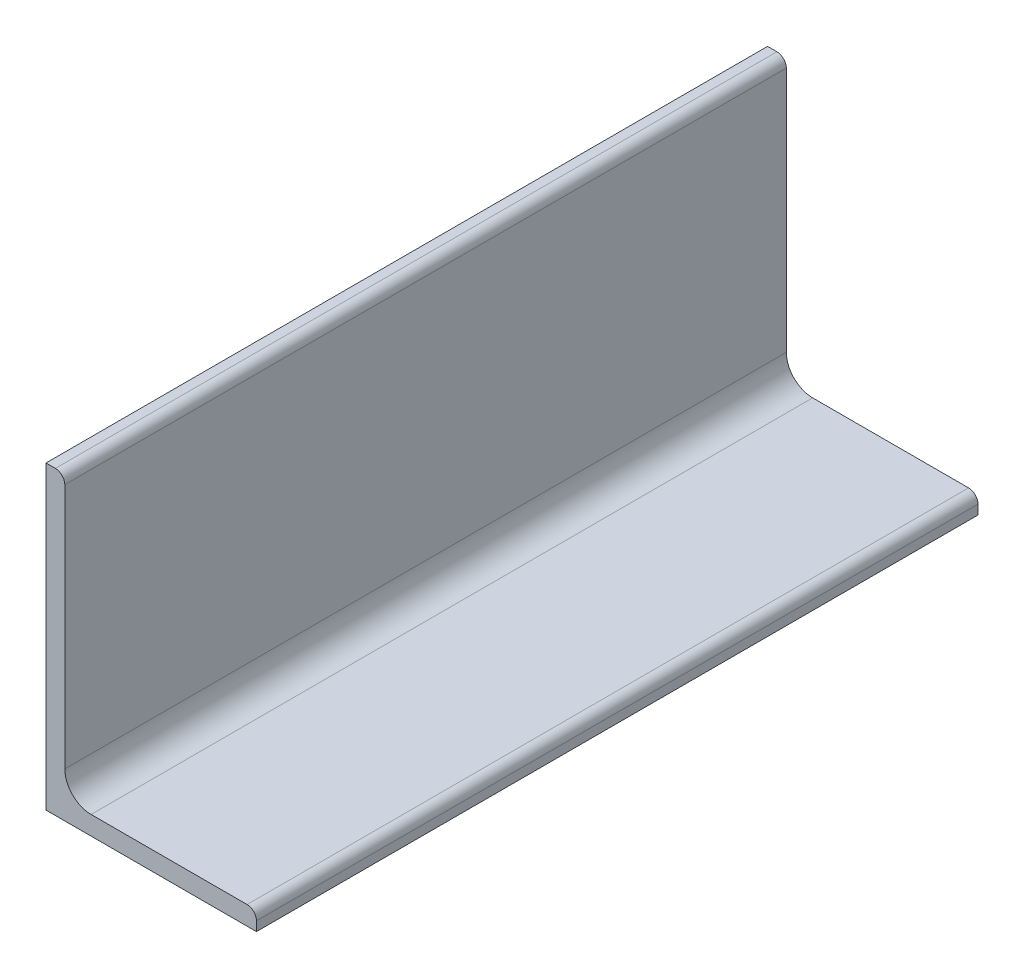
ISO-10303-21;
HEADER;
FILE_DESCRIPTION(('STEP AP214'),'2;1');
FILE_NAME('part.step','',(''),(''),'','','');
FILE_SCHEMA(('AUTOMOTIVE_DESIGN { 1 0 10303 214 1 1 1 1 }'));
ENDSEC;
DATA;
#1=APPLICATION_CONTEXT('core data for automotive mechanical design processes');
#2=APPLICATION_PROTOCOL_DEFINITION('international standard','automotive_design',2000,#1);
#3=PRODUCT_CONTEXT('',#1,'mechanical');
#4=PRODUCT('Part','Part','',(#3));
#5=PRODUCT_RELATED_PRODUCT_CATEGORY('part','',(#4));
#6=PRODUCT_DEFINITION_FORMATION('','',#4);
#7=PRODUCT_DEFINITION_CONTEXT('part definition',#1,'design');
#8=PRODUCT_DEFINITION('design','',#6,#7);
#9=PRODUCT_DEFINITION_SHAPE('','',#8);
#10=(LENGTH_UNIT() NAMED_UNIT(*) SI_UNIT(.MILLI.,.METRE.));
#11=(NAMED_UNIT(*) PLANE_ANGLE_UNIT() SI_UNIT($,.RADIAN.));
#12=(NAMED_UNIT(*) SI_UNIT($,.STERADIAN.) SOLID_ANGLE_UNIT());
#13=UNCERTAINTY_MEASURE_WITH_UNIT(LENGTH_MEASURE(1.E-05),#10,'distance_accuracy_value','');
#14=(GEOMETRIC_REPRESENTATION_CONTEXT(3) GLOBAL_UNCERTAINTY_ASSIGNED_CONTEXT((#13)) GLOBAL_UNIT_ASSIGNED_CONTEXT((#10,
#11,#12)) REPRESENTATION_CONTEXT('',''));
#15=CARTESIAN_POINT('',(0.,0.,0.));
#16=DIRECTION('',(0.,0.,1.));
#17=DIRECTION('',(1.,0.,0.));
#18=AXIS2_PLACEMENT_3D('',#15,#16,#17);
#19=CARTESIAN_POINT('',(0.0836264027816469,127.041655270204,304.8));
#20=DIRECTION('',(1.,0.,0.));
#21=DIRECTION('',(0.,0.,-1.));
#22=AXIS2_PLACEMENT_3D('',#19,#20,#21);
#23=PLANE('',#22);
#24=DIRECTION('',(0.,-1.,0.));
#25=VECTOR('',#24,1.);
#26=CARTESIAN_POINT('',(0.0836264027816469,127.041655270204,0.));
#27=LINE('',#26,#25);
#28=CARTESIAN_POINT('',(0.0836264027816469,127.041655270204,0.));
#29=VERTEX_POINT('',#28);
#30=CARTESIAN_POINT('',(0.0836264027816469,0.0416552702040917,0.));
#31=VERTEX_POINT('',#30);
#32=EDGE_CURVE('E135',#29,#31,#27,.T.);
#33=ORIENTED_EDGE('',*,*,#32,.T.);
#34=DIRECTION('',(0.,0.,-1.));
#35=VECTOR('',#34,1.);
#36=CARTESIAN_POINT('',(0.0836264027816469,0.0416552702040917,304.8));
#37=LINE('',#36,#35);
#38=CARTESIAN_POINT('',(0.0836264027816469,0.0416552702040917,304.8));
#39=VERTEX_POINT('',#38);
#40=EDGE_CURVE('E11',#39,#31,#37,.T.);
#41=ORIENTED_EDGE('',*,*,#40,.F.);
#42=DIRECTION('',(0.,-1.,0.));
#43=VECTOR('',#42,1.);
#44=CARTESIAN_POINT('',(0.0836264027816469,127.041655270204,304.8));
#45=LINE('',#44,#43);
#46=CARTESIAN_POINT('',(0.0836264027816469,127.041655270204,304.8));
#47=VERTEX_POINT('',#46);
#48=EDGE_CURVE('E151',#47,#39,#45,.T.);
#49=ORIENTED_EDGE('',*,*,#48,.F.);
#50=DIRECTION('',(0.,0.,-1.));
#51=VECTOR('',#50,1.);
#52=CARTESIAN_POINT('',(0.0836264027816469,127.041655270204,304.8));
#53=LINE('',#52,#51);
#54=EDGE_CURVE('E131',#47,#29,#53,.T.);
#55=ORIENTED_EDGE('',*,*,#54,.T.);
#56=EDGE_LOOP('',(#33,#41,#49,#55));
#57=FACE_BOUND('',#56,.T.);
#58=ADVANCED_FACE('F33',(#57),#23,.F.);
#59=CARTESIAN_POINT('',(0.0836264027816469,0.0416552702040917,304.8));
#60=DIRECTION('',(0.,1.,0.));
#61=DIRECTION('',(0.,0.,1.));
#62=AXIS2_PLACEMENT_3D('',#59,#60,#61);
#63=PLANE('',#62);
#64=DIRECTION('',(1.,0.,0.));
#65=VECTOR('',#64,1.);
#66=CARTESIAN_POINT('',(0.0836264027816469,0.0416552702040917,0.));
#67=LINE('',#66,#65);
#68=CARTESIAN_POINT('',(88.9836264027817,0.0416552702040917,0.));
#69=VERTEX_POINT('',#68);
#70=EDGE_CURVE('E138',#31,#69,#67,.T.);
#71=ORIENTED_EDGE('',*,*,#70,.T.);
#72=DIRECTION('',(0.,0.,-1.));
#73=VECTOR('',#72,1.);
#74=CARTESIAN_POINT('',(88.9836264027817,0.0416552702040917,304.8));
#75=LINE('',#74,#73);
#76=CARTESIAN_POINT('',(88.9836264027817,0.0416552702040917,304.8));
#77=VERTEX_POINT('',#76);
#78=EDGE_CURVE('E41',#77,#69,#75,.T.);
#79=ORIENTED_EDGE('',*,*,#78,.F.);
#80=DIRECTION('',(1.,0.,0.));
#81=VECTOR('',#80,1.);
#82=CARTESIAN_POINT('',(0.0836264027816469,0.0416552702040917,304.8));
#83=LINE('',#82,#81);
#84=EDGE_CURVE('E95',#39,#77,#83,.T.);
#85=ORIENTED_EDGE('',*,*,#84,.F.);
#86=ORIENTED_EDGE('',*,*,#40,.T.);
#87=EDGE_LOOP('',(#71,#79,#85,#86));
#88=FACE_BOUND('',#87,.T.);
#89=ADVANCED_FACE('F194',(#88),#63,.F.);
#90=CARTESIAN_POINT('',(88.9836264027817,0.0416552702040917,304.8));
#91=DIRECTION('',(-1.,0.,0.));
#92=DIRECTION('',(0.,0.,1.));
#93=AXIS2_PLACEMENT_3D('',#90,#91,#92);
#94=PLANE('',#93);
#95=DIRECTION('',(0.,1.,0.));
#96=VECTOR('',#95,1.);
#97=CARTESIAN_POINT('',(88.9836264027817,0.0416552702040917,0.));
#98=LINE('',#97,#96);
#99=CARTESIAN_POINT('',(88.9836264027817,4.01040527020409,0.));
#100=VERTEX_POINT('',#99);
#101=EDGE_CURVE('E140',#69,#100,#98,.T.);
#102=ORIENTED_EDGE('',*,*,#101,.T.);
#103=DIRECTION('',(0.,0.,-1.));
#104=VECTOR('',#103,1.);
#105=CARTESIAN_POINT('',(88.9836264027817,4.01040527020409,304.8));
#106=LINE('',#105,#104);
#107=CARTESIAN_POINT('',(88.9836264027817,4.01040527020409,304.8));
#108=VERTEX_POINT('',#107);
#109=EDGE_CURVE('E161',#108,#100,#106,.T.);
#110=ORIENTED_EDGE('',*,*,#109,.F.);
#111=DIRECTION('',(0.,1.,0.));
#112=VECTOR('',#111,1.);
#113=CARTESIAN_POINT('',(88.9836264027817,0.0416552702040917,304.8));
#114=LINE('',#113,#112);
#115=EDGE_CURVE('E169',#77,#108,#114,.T.);
#116=ORIENTED_EDGE('',*,*,#115,.F.);
#117=ORIENTED_EDGE('',*,*,#78,.T.);
#118=EDGE_LOOP('',(#102,#110,#116,#117));
#119=FACE_BOUND('',#118,.T.);
#120=ADVANCED_FACE('F167',(#119),#94,.F.);
#121=CARTESIAN_POINT('',(85.0148764027816,4.01040527020409,304.8));
#122=DIRECTION('',(0.,0.,-1.));
#123=DIRECTION('',(-1.,0.,0.));
#124=AXIS2_PLACEMENT_3D('',#121,#122,#123);
#125=CYLINDRICAL_SURFACE('',#124,3.96875);
#126=CARTESIAN_POINT('',(85.0148764027816,4.01040527020409,0.));
#127=DIRECTION('',(0.,0.,1.));
#128=DIRECTION('',(1.,0.,0.));
#129=AXIS2_PLACEMENT_3D('',#126,#127,#128);
#130=CIRCLE('',#129,3.96875);
#131=CARTESIAN_POINT('',(85.0148764027816,7.97915527020409,0.));
#132=VERTEX_POINT('',#131);
#133=EDGE_CURVE('E142',#100,#132,#130,.T.);
#134=ORIENTED_EDGE('',*,*,#133,.T.);
#135=DIRECTION('',(0.,0.,-1.));
#136=VECTOR('',#135,1.);
#137=CARTESIAN_POINT('',(85.0148764027816,7.97915527020409,304.8));
#138=LINE('',#137,#136);
#139=CARTESIAN_POINT('',(85.0148764027816,7.97915527020409,304.8));
#140=VERTEX_POINT('',#139);
#141=EDGE_CURVE('E158',#140,#132,#138,.T.);
#142=ORIENTED_EDGE('',*,*,#141,.F.);
#143=CARTESIAN_POINT('',(85.0148764027816,4.01040527020409,304.8));
#144=DIRECTION('',(0.,0.,1.));
#145=DIRECTION('',(1.,0.,0.));
#146=AXIS2_PLACEMENT_3D('',#143,#144,#145);
#147=CIRCLE('',#146,3.96875);
#148=EDGE_CURVE('E185',#108,#140,#147,.T.);
#149=ORIENTED_EDGE('',*,*,#148,.F.);
#150=ORIENTED_EDGE('',*,*,#109,.T.);
#151=EDGE_LOOP('',(#134,#142,#149,#150));
#152=FACE_BOUND('',#151,.T.);
#153=ADVANCED_FACE('F178',(#152),#125,.T.);
#154=CARTESIAN_POINT('',(85.0148764027816,7.97915527020409,304.8));
#155=DIRECTION('',(0.,-1.,0.));
#156=DIRECTION('',(0.,0.,-1.));
#157=AXIS2_PLACEMENT_3D('',#154,#155,#156);
#158=PLANE('',#157);
#159=DIRECTION('',(-1.,0.,0.));
#160=VECTOR('',#159,1.);
#161=CARTESIAN_POINT('',(85.0148764027816,7.97915527020409,0.));
#162=LINE('',#161,#160);
#163=CARTESIAN_POINT('',(19.1336264027816,7.97915527020409,0.));
#164=VERTEX_POINT('',#163);
#165=EDGE_CURVE('E144',#132,#164,#162,.T.);
#166=ORIENTED_EDGE('',*,*,#165,.T.);
#167=DIRECTION('',(0.,0.,-1.));
#168=VECTOR('',#167,1.);
#169=CARTESIAN_POINT('',(19.1336264027816,7.97915527020409,304.8));
#170=LINE('',#169,#168);
#171=CARTESIAN_POINT('',(19.1336264027816,7.97915527020409,304.8));
#172=VERTEX_POINT('',#171);
#173=EDGE_CURVE('E155',#172,#164,#170,.T.);
#174=ORIENTED_EDGE('',*,*,#173,.F.);
#175=DIRECTION('',(-1.,0.,0.));
#176=VECTOR('',#175,1.);
#177=CARTESIAN_POINT('',(85.0148764027816,7.97915527020409,304.8));
#178=LINE('',#177,#176);
#179=EDGE_CURVE('E184',#140,#172,#178,.T.);
#180=ORIENTED_EDGE('',*,*,#179,.F.);
#181=ORIENTED_EDGE('',*,*,#141,.T.);
#182=EDGE_LOOP('',(#166,#174,#180,#181));
#183=FACE_BOUND('',#182,.T.);
#184=ADVANCED_FACE('F182',(#183),#158,.F.);
#185=CARTESIAN_POINT('',(19.1336264027816,19.0916552702041,304.8));
#186=DIRECTION('',(0.,0.,-1.));
#187=DIRECTION('',(-1.,0.,0.));
#188=AXIS2_PLACEMENT_3D('',#185,#186,#187);
#189=CYLINDRICAL_SURFACE('',#188,11.1125);
#190=CARTESIAN_POINT('',(19.1336264027816,19.0916552702041,0.));
#191=DIRECTION('',(0.,0.,-1.));
#192=DIRECTION('',(1.,0.,0.));
#193=AXIS2_PLACEMENT_3D('',#190,#191,#192);
#194=CIRCLE('',#193,11.1125);
#195=CARTESIAN_POINT('',(8.02112640278165,19.0916552702041,0.));
#196=VERTEX_POINT('',#195);
#197=EDGE_CURVE('E146',#164,#196,#194,.T.);
#198=ORIENTED_EDGE('',*,*,#197,.T.);
#199=DIRECTION('',(0.,0.,-1.));
#200=VECTOR('',#199,1.);
#201=CARTESIAN_POINT('',(8.02112640278165,19.0916552702041,304.8));
#202=LINE('',#201,#200);
#203=CARTESIAN_POINT('',(8.02112640278165,19.0916552702041,304.8));
#204=VERTEX_POINT('',#203);
#205=EDGE_CURVE('E126',#204,#196,#202,.T.);
#206=ORIENTED_EDGE('',*,*,#205,.F.);
#207=CARTESIAN_POINT('',(19.1336264027816,19.0916552702041,304.8));
#208=DIRECTION('',(0.,0.,-1.));
#209=DIRECTION('',(1.,0.,0.));
#210=AXIS2_PLACEMENT_3D('',#207,#208,#209);
#211=CIRCLE('',#210,11.1125);
#212=EDGE_CURVE('E117',#172,#204,#211,.T.);
#213=ORIENTED_EDGE('',*,*,#212,.F.);
#214=ORIENTED_EDGE('',*,*,#173,.T.);
#215=EDGE_LOOP('',(#198,#206,#213,#214));
#216=FACE_BOUND('',#215,.T.);
#217=ADVANCED_FACE('F206',(#216),#189,.F.);
#218=CARTESIAN_POINT('',(8.02112640278165,19.0916552702041,304.8));
#219=DIRECTION('',(-1.,0.,0.));
#220=DIRECTION('',(0.,0.,1.));
#221=AXIS2_PLACEMENT_3D('',#218,#219,#220);
#222=PLANE('',#221);
#223=DIRECTION('',(0.,1.,0.));
#224=VECTOR('',#223,1.);
#225=CARTESIAN_POINT('',(8.02112640278165,19.0916552702041,0.));
#226=LINE('',#225,#224);
#227=CARTESIAN_POINT('',(8.02112640278165,123.072905270204,0.));
#228=VERTEX_POINT('',#227);
#229=EDGE_CURVE('E125',#196,#228,#226,.T.);
#230=ORIENTED_EDGE('',*,*,#229,.T.);
#231=DIRECTION('',(0.,0.,-1.));
#232=VECTOR('',#231,1.);
#233=CARTESIAN_POINT('',(8.02112640278165,123.072905270204,304.8));
#234=LINE('',#233,#232);
#235=CARTESIAN_POINT('',(8.02112640278165,123.072905270204,304.8));
#236=VERTEX_POINT('',#235);
#237=EDGE_CURVE('E122',#236,#228,#234,.T.);
#238=ORIENTED_EDGE('',*,*,#237,.F.);
#239=DIRECTION('',(0.,1.,0.));
#240=VECTOR('',#239,1.);
#241=CARTESIAN_POINT('',(8.02112640278165,19.0916552702041,304.8));
#242=LINE('',#241,#240);
#243=EDGE_CURVE('E111',#204,#236,#242,.T.);
#244=ORIENTED_EDGE('',*,*,#243,.F.);
#245=ORIENTED_EDGE('',*,*,#205,.T.);
#246=EDGE_LOOP('',(#230,#238,#244,#245));
#247=FACE_BOUND('',#246,.T.);
#248=ADVANCED_FACE('F123',(#247),#222,.F.);
#249=CARTESIAN_POINT('',(4.05237640278166,123.072905270204,304.8));
#250=DIRECTION('',(0.,0.,-1.));
#251=DIRECTION('',(-1.,0.,0.));
#252=AXIS2_PLACEMENT_3D('',#249,#250,#251);
#253=CYLINDRICAL_SURFACE('',#252,3.96875);
#254=CARTESIAN_POINT('',(4.05237640278166,123.072905270204,0.));
#255=DIRECTION('',(0.,0.,1.));
#256=DIRECTION('',(1.,0.,0.));
#257=AXIS2_PLACEMENT_3D('',#254,#255,#256);
#258=CIRCLE('',#257,3.96875);
#259=CARTESIAN_POINT('',(4.05237640278165,127.041655270204,0.));
#260=VERTEX_POINT('',#259);
#261=EDGE_CURVE('E81',#228,#260,#258,.T.);
#262=ORIENTED_EDGE('',*,*,#261,.T.);
#263=DIRECTION('',(0.,0.,-1.));
#264=VECTOR('',#263,1.);
#265=CARTESIAN_POINT('',(4.05237640278165,127.041655270204,304.8));
#266=LINE('',#265,#264);
#267=CARTESIAN_POINT('',(4.05237640278165,127.041655270204,304.8));
#268=VERTEX_POINT('',#267);
#269=EDGE_CURVE('E127',#268,#260,#266,.T.);
#270=ORIENTED_EDGE('',*,*,#269,.F.);
#271=CARTESIAN_POINT('',(4.05237640278166,123.072905270204,304.8));
#272=DIRECTION('',(0.,0.,1.));
#273=DIRECTION('',(1.,0.,0.));
#274=AXIS2_PLACEMENT_3D('',#271,#272,#273);
#275=CIRCLE('',#274,3.96875);
#276=EDGE_CURVE('E115',#236,#268,#275,.T.);
#277=ORIENTED_EDGE('',*,*,#276,.F.);
#278=ORIENTED_EDGE('',*,*,#237,.T.);
#279=EDGE_LOOP('',(#262,#270,#277,#278));
#280=FACE_BOUND('',#279,.T.);
#281=ADVANCED_FACE('F129',(#280),#253,.T.);
#282=CARTESIAN_POINT('',(4.05237640278165,127.041655270204,304.8));
#283=DIRECTION('',(0.,-1.,0.));
#284=DIRECTION('',(0.,0.,-1.));
#285=AXIS2_PLACEMENT_3D('',#282,#283,#284);
#286=PLANE('',#285);
#287=DIRECTION('',(-1.,0.,0.));
#288=VECTOR('',#287,1.);
#289=CARTESIAN_POINT('',(4.05237640278165,127.041655270204,0.));
#290=LINE('',#289,#288);
#291=EDGE_CURVE('E87',#260,#29,#290,.T.);
#292=ORIENTED_EDGE('',*,*,#291,.T.);
#293=ORIENTED_EDGE('',*,*,#54,.F.);
#294=DIRECTION('',(-1.,0.,0.));
#295=VECTOR('',#294,1.);
#296=CARTESIAN_POINT('',(4.05237640278165,127.041655270204,304.8));
#297=LINE('',#296,#295);
#298=EDGE_CURVE('E49',#268,#47,#297,.T.);
#299=ORIENTED_EDGE('',*,*,#298,.F.);
#300=ORIENTED_EDGE('',*,*,#269,.T.);
#301=EDGE_LOOP('',(#292,#293,#299,#300));
#302=FACE_BOUND('',#301,.T.);
#303=ADVANCED_FACE('F214',(#302),#286,.F.);
#304=CARTESIAN_POINT('',(85.0148764027816,4.01040527020409,304.8));
#305=DIRECTION('',(0.,0.,1.));
#306=DIRECTION('',(1.,0.,0.));
#307=AXIS2_PLACEMENT_3D('',#304,#305,#306);
#308=PLANE('',#307);
#309=ORIENTED_EDGE('',*,*,#48,.T.);
#310=ORIENTED_EDGE('',*,*,#84,.T.);
#311=ORIENTED_EDGE('',*,*,#115,.T.);
#312=ORIENTED_EDGE('',*,*,#148,.T.);
#313=ORIENTED_EDGE('',*,*,#179,.T.);
#314=ORIENTED_EDGE('',*,*,#212,.T.);
#315=ORIENTED_EDGE('',*,*,#243,.T.);
#316=ORIENTED_EDGE('',*,*,#276,.T.);
#317=ORIENTED_EDGE('',*,*,#298,.T.);
#318=EDGE_LOOP('',(#309,#310,#311,#312,#313,#314,#315,#316,#317));
#319=FACE_BOUND('',#318,.T.);
#320=ADVANCED_FACE('F113',(#319),#308,.T.);
#321=CARTESIAN_POINT('',(85.0148764027816,4.01040527020409,0.));
#322=DIRECTION('',(0.,0.,1.));
#323=DIRECTION('',(1.,0.,0.));
#324=AXIS2_PLACEMENT_3D('',#321,#322,#323);
#325=PLANE('',#324);
#326=ORIENTED_EDGE('',*,*,#32,.F.);
#327=ORIENTED_EDGE('',*,*,#291,.F.);
#328=ORIENTED_EDGE('',*,*,#261,.F.);
#329=ORIENTED_EDGE('',*,*,#229,.F.);
#330=ORIENTED_EDGE('',*,*,#197,.F.);
#331=ORIENTED_EDGE('',*,*,#165,.F.);
#332=ORIENTED_EDGE('',*,*,#133,.F.);
#333=ORIENTED_EDGE('',*,*,#101,.F.);
#334=ORIENTED_EDGE('',*,*,#70,.F.);
#335=EDGE_LOOP('',(#326,#327,#328,#329,#330,#331,#332,#333,#334));
#336=FACE_BOUND('',#335,.T.);
#337=ADVANCED_FACE('F173',(#336),#325,.F.);
#338=CLOSED_SHELL('',(#58,#89,#120,#153,#184,#217,#248,#281,#303,#320,#337));
#339=MANIFOLD_SOLID_BREP('B2',#338);
#340=ADVANCED_BREP_SHAPE_REPRESENTATION('',(#18,#339),#14);
#341=SHAPE_DEFINITION_REPRESENTATION(#9,#340);
ENDSEC;
END-ISO-10303-21;
